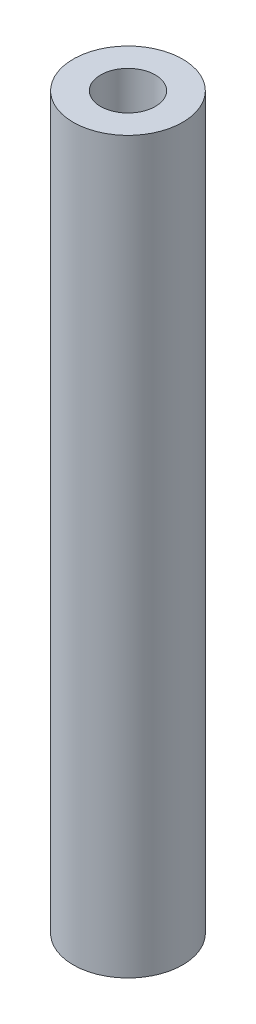
ISO-10303-21;
HEADER;
FILE_DESCRIPTION(('STEP AP214'),'2;1');
FILE_NAME('part.step','',(''),(''),'','','');
FILE_SCHEMA(('AUTOMOTIVE_DESIGN { 1 0 10303 214 1 1 1 1 }'));
ENDSEC;
DATA;
#1=APPLICATION_CONTEXT('core data for automotive mechanical design processes');
#2=APPLICATION_PROTOCOL_DEFINITION('international standard','automotive_design',2000,#1);
#3=PRODUCT_CONTEXT('',#1,'mechanical');
#4=PRODUCT('Part','Part','',(#3));
#5=PRODUCT_RELATED_PRODUCT_CATEGORY('part','',(#4));
#6=PRODUCT_DEFINITION_FORMATION('','',#4);
#7=PRODUCT_DEFINITION_CONTEXT('part definition',#1,'design');
#8=PRODUCT_DEFINITION('design','',#6,#7);
#9=PRODUCT_DEFINITION_SHAPE('','',#8);
#10=(LENGTH_UNIT() NAMED_UNIT(*) SI_UNIT(.MILLI.,.METRE.));
#11=(NAMED_UNIT(*) PLANE_ANGLE_UNIT() SI_UNIT($,.RADIAN.));
#12=(NAMED_UNIT(*) SI_UNIT($,.STERADIAN.) SOLID_ANGLE_UNIT());
#13=UNCERTAINTY_MEASURE_WITH_UNIT(LENGTH_MEASURE(1.E-05),#10,'distance_accuracy_value','');
#14=(GEOMETRIC_REPRESENTATION_CONTEXT(3) GLOBAL_UNCERTAINTY_ASSIGNED_CONTEXT((#13)) GLOBAL_UNIT_ASSIGNED_CONTEXT((#10,
#11,#12)) REPRESENTATION_CONTEXT('',''));
#15=CARTESIAN_POINT('',(0.,0.,0.));
#16=DIRECTION('',(0.,0.,1.));
#17=DIRECTION('',(1.,0.,0.));
#18=AXIS2_PLACEMENT_3D('',#15,#16,#17);
#19=CARTESIAN_POINT('',(0.,40.,0.));
#20=DIRECTION('',(0.,-1.,0.));
#21=DIRECTION('',(0.,0.,-1.));
#22=AXIS2_PLACEMENT_3D('',#19,#20,#21);
#23=CYLINDRICAL_SURFACE('',#22,3.);
#24=CARTESIAN_POINT('',(0.,40.,0.));
#25=DIRECTION('',(0.,1.,0.));
#26=DIRECTION('',(0.,0.,1.));
#27=AXIS2_PLACEMENT_3D('',#24,#25,#26);
#28=CIRCLE('',#27,3.);
#29=CARTESIAN_POINT('',(0.,40.,3.));
#30=VERTEX_POINT('',#29);
#31=EDGE_CURVE('E10',#30,#30,#28,.T.);
#32=ORIENTED_EDGE('',*,*,#31,.F.);
#33=EDGE_LOOP('',(#32));
#34=FACE_BOUND('',#33,.T.);
#35=CARTESIAN_POINT('',(0.,0.,0.));
#36=DIRECTION('',(0.,1.,0.));
#37=DIRECTION('',(0.,0.,1.));
#38=AXIS2_PLACEMENT_3D('',#35,#36,#37);
#39=CIRCLE('',#38,3.);
#40=CARTESIAN_POINT('',(0.,0.,3.));
#41=VERTEX_POINT('',#40);
#42=EDGE_CURVE('E34',#41,#41,#39,.T.);
#43=ORIENTED_EDGE('',*,*,#42,.T.);
#44=EDGE_LOOP('',(#43));
#45=FACE_BOUND('',#44,.T.);
#46=ADVANCED_FACE('F31',(#34,#45),#23,.T.);
#47=CARTESIAN_POINT('',(0.,40.,0.));
#48=DIRECTION('',(0.,1.,0.));
#49=DIRECTION('',(0.,0.,1.));
#50=AXIS2_PLACEMENT_3D('',#47,#48,#49);
#51=PLANE('',#50);
#52=CARTESIAN_POINT('',(0.,40.,0.));
#53=DIRECTION('',(0.,1.,0.));
#54=DIRECTION('',(0.,0.,1.));
#55=AXIS2_PLACEMENT_3D('',#52,#53,#54);
#56=CIRCLE('',#55,1.5);
#57=CARTESIAN_POINT('',(0.,40.,1.5));
#58=VERTEX_POINT('',#57);
#59=EDGE_CURVE('E43',#58,#58,#56,.T.);
#60=ORIENTED_EDGE('',*,*,#59,.F.);
#61=EDGE_LOOP('',(#60));
#62=FACE_BOUND('',#61,.T.);
#63=ORIENTED_EDGE('',*,*,#31,.T.);
#64=EDGE_LOOP('',(#63));
#65=FACE_BOUND('',#64,.T.);
#66=ADVANCED_FACE('F58',(#62,#65),#51,.T.);
#67=CARTESIAN_POINT('',(0.,0.,0.));
#68=DIRECTION('',(0.,1.,0.));
#69=DIRECTION('',(0.,0.,1.));
#70=AXIS2_PLACEMENT_3D('',#67,#68,#69);
#71=PLANE('',#70);
#72=CARTESIAN_POINT('',(0.,0.,0.));
#73=DIRECTION('',(0.,1.,0.));
#74=DIRECTION('',(0.,0.,1.));
#75=AXIS2_PLACEMENT_3D('',#72,#73,#74);
#76=CIRCLE('',#75,1.5);
#77=CARTESIAN_POINT('',(0.,0.,1.5));
#78=VERTEX_POINT('',#77);
#79=EDGE_CURVE('E41',#78,#78,#76,.T.);
#80=ORIENTED_EDGE('',*,*,#79,.T.);
#81=EDGE_LOOP('',(#80));
#82=FACE_BOUND('',#81,.T.);
#83=ORIENTED_EDGE('',*,*,#42,.F.);
#84=EDGE_LOOP('',(#83));
#85=FACE_BOUND('',#84,.T.);
#86=ADVANCED_FACE('F49',(#82,#85),#71,.F.);
#87=CARTESIAN_POINT('',(0.,0.,0.));
#88=DIRECTION('',(0.,1.,0.));
#89=DIRECTION('',(0.,0.,1.));
#90=AXIS2_PLACEMENT_3D('',#87,#88,#89);
#91=CYLINDRICAL_SURFACE('',#90,1.5);
#92=ORIENTED_EDGE('',*,*,#79,.F.);
#93=EDGE_LOOP('',(#92));
#94=FACE_BOUND('',#93,.T.);
#95=ORIENTED_EDGE('',*,*,#59,.T.);
#96=EDGE_LOOP('',(#95));
#97=FACE_BOUND('',#96,.T.);
#98=ADVANCED_FACE('F52',(#94,#97),#91,.F.);
#99=CLOSED_SHELL('',(#46,#66,#86,#98));
#100=MANIFOLD_SOLID_BREP('B2',#99);
#101=ADVANCED_BREP_SHAPE_REPRESENTATION('',(#18,#100),#14);
#102=SHAPE_DEFINITION_REPRESENTATION(#9,#101);
ENDSEC;
END-ISO-10303-21;
